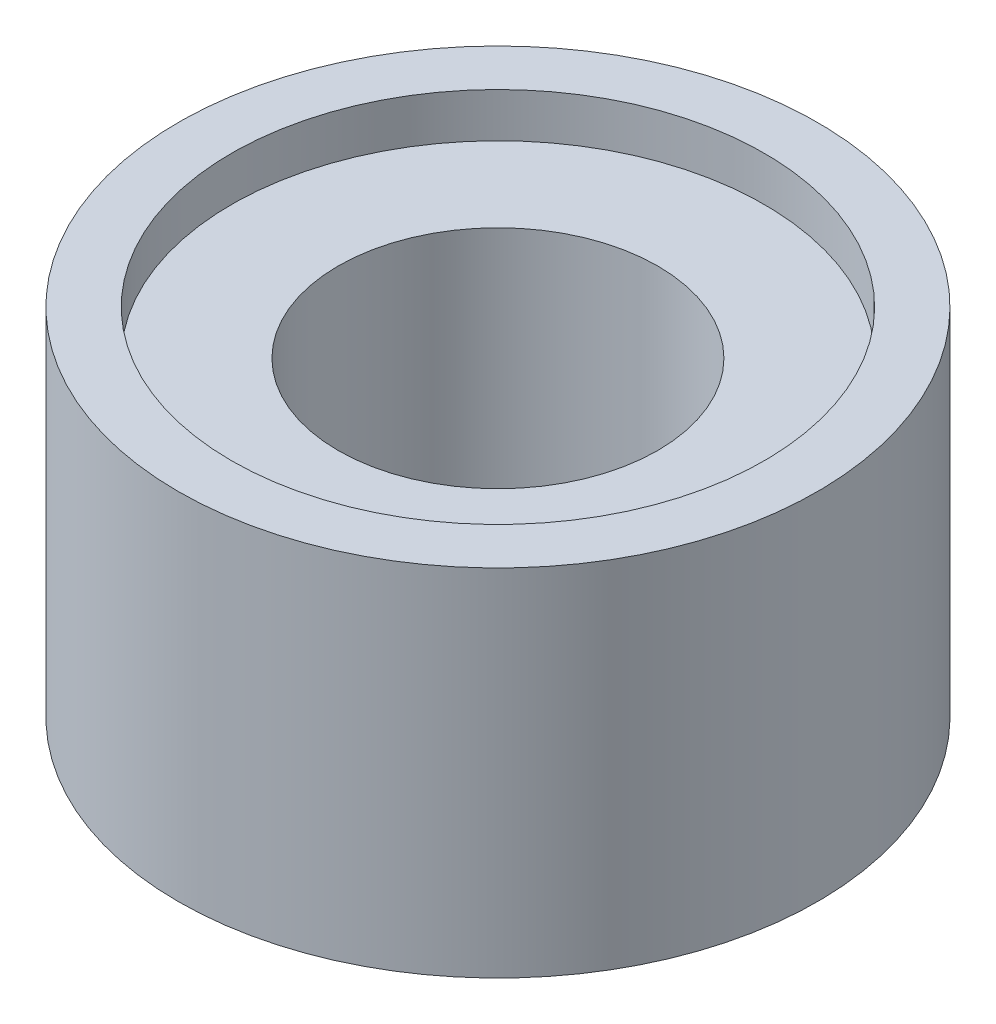
ISO-10303-21;
HEADER;
FILE_DESCRIPTION(('STEP AP214'),'2;1');
FILE_NAME('part.step','',(''),(''),'','','');
FILE_SCHEMA(('AUTOMOTIVE_DESIGN { 1 0 10303 214 1 1 1 1 }'));
ENDSEC;
DATA;
#1=APPLICATION_CONTEXT('core data for automotive mechanical design processes');
#2=APPLICATION_PROTOCOL_DEFINITION('international standard','automotive_design',2000,#1);
#3=PRODUCT_CONTEXT('',#1,'mechanical');
#4=PRODUCT('Part','Part','',(#3));
#5=PRODUCT_RELATED_PRODUCT_CATEGORY('part','',(#4));
#6=PRODUCT_DEFINITION_FORMATION('','',#4);
#7=PRODUCT_DEFINITION_CONTEXT('part definition',#1,'design');
#8=PRODUCT_DEFINITION('design','',#6,#7);
#9=PRODUCT_DEFINITION_SHAPE('','',#8);
#10=(LENGTH_UNIT() NAMED_UNIT(*) SI_UNIT(.MILLI.,.METRE.));
#11=(NAMED_UNIT(*) PLANE_ANGLE_UNIT() SI_UNIT($,.RADIAN.));
#12=(NAMED_UNIT(*) SI_UNIT($,.STERADIAN.) SOLID_ANGLE_UNIT());
#13=UNCERTAINTY_MEASURE_WITH_UNIT(LENGTH_MEASURE(1.E-05),#10,'distance_accuracy_value','');
#14=(GEOMETRIC_REPRESENTATION_CONTEXT(3) GLOBAL_UNCERTAINTY_ASSIGNED_CONTEXT((#13)) GLOBAL_UNIT_ASSIGNED_CONTEXT((#10,
#11,#12)) REPRESENTATION_CONTEXT('',''));
#15=CARTESIAN_POINT('',(0.,0.,0.));
#16=DIRECTION('',(0.,0.,1.));
#17=DIRECTION('',(1.,0.,0.));
#18=AXIS2_PLACEMENT_3D('',#15,#16,#17);
#19=CARTESIAN_POINT('',(0.,7.5,0.));
#20=DIRECTION('',(0.,1.,0.));
#21=DIRECTION('',(0.,0.,1.));
#22=AXIS2_PLACEMENT_3D('',#19,#20,#21);
#23=PLANE('',#22);
#24=CARTESIAN_POINT('',(0.,7.5,0.));
#25=DIRECTION('',(0.,1.,0.));
#26=DIRECTION('',(0.,0.,1.));
#27=AXIS2_PLACEMENT_3D('',#24,#25,#26);
#28=CIRCLE('',#27,15.);
#29=CARTESIAN_POINT('',(0.,7.5,15.));
#30=VERTEX_POINT('',#29);
#31=EDGE_CURVE('E46',#30,#30,#28,.F.);
#32=ORIENTED_EDGE('',*,*,#31,.F.);
#33=EDGE_LOOP('',(#32));
#34=FACE_BOUND('',#33,.T.);
#35=CARTESIAN_POINT('',(0.,7.5,0.));
#36=DIRECTION('',(0.,1.,0.));
#37=DIRECTION('',(0.,0.,1.));
#38=AXIS2_PLACEMENT_3D('',#35,#36,#37);
#39=CIRCLE('',#38,9.);
#40=CARTESIAN_POINT('',(0.,7.5,9.));
#41=VERTEX_POINT('',#40);
#42=EDGE_CURVE('E37',#41,#41,#39,.T.);
#43=ORIENTED_EDGE('',*,*,#42,.F.);
#44=EDGE_LOOP('',(#43));
#45=FACE_BOUND('',#44,.T.);
#46=ADVANCED_FACE('F30',(#34,#45),#23,.T.);
#47=CARTESIAN_POINT('',(0.,-7.5,0.));
#48=DIRECTION('',(0.,1.,0.));
#49=DIRECTION('',(0.,0.,1.));
#50=AXIS2_PLACEMENT_3D('',#47,#48,#49);
#51=PLANE('',#50);
#52=CARTESIAN_POINT('',(0.,-7.5,0.));
#53=DIRECTION('',(0.,1.,0.));
#54=DIRECTION('',(0.,0.,1.));
#55=AXIS2_PLACEMENT_3D('',#52,#53,#54);
#56=CIRCLE('',#55,15.);
#57=CARTESIAN_POINT('',(0.,-7.5,15.));
#58=VERTEX_POINT('',#57);
#59=EDGE_CURVE('E10',#58,#58,#56,.T.);
#60=ORIENTED_EDGE('',*,*,#59,.F.);
#61=EDGE_LOOP('',(#60));
#62=FACE_BOUND('',#61,.T.);
#63=CARTESIAN_POINT('',(0.,-7.5,0.));
#64=DIRECTION('',(0.,1.,0.));
#65=DIRECTION('',(0.,0.,1.));
#66=AXIS2_PLACEMENT_3D('',#63,#64,#65);
#67=CIRCLE('',#66,9.);
#68=CARTESIAN_POINT('',(0.,-7.5,9.));
#69=VERTEX_POINT('',#68);
#70=EDGE_CURVE('E41',#69,#69,#67,.T.);
#71=ORIENTED_EDGE('',*,*,#70,.T.);
#72=EDGE_LOOP('',(#71));
#73=FACE_BOUND('',#72,.T.);
#74=ADVANCED_FACE('F32',(#62,#73),#51,.F.);
#75=CARTESIAN_POINT('',(0.,7.5,0.));
#76=DIRECTION('',(0.,-1.,0.));
#77=DIRECTION('',(0.,0.,-1.));
#78=AXIS2_PLACEMENT_3D('',#75,#76,#77);
#79=CYLINDRICAL_SURFACE('',#78,9.);
#80=ORIENTED_EDGE('',*,*,#42,.T.);
#81=EDGE_LOOP('',(#80));
#82=FACE_BOUND('',#81,.T.);
#83=ORIENTED_EDGE('',*,*,#70,.F.);
#84=EDGE_LOOP('',(#83));
#85=FACE_BOUND('',#84,.T.);
#86=ADVANCED_FACE('F78',(#82,#85),#79,.F.);
#87=CARTESIAN_POINT('',(0.,10.,0.));
#88=DIRECTION('',(0.,-1.,0.));
#89=DIRECTION('',(0.,0.,-1.));
#90=AXIS2_PLACEMENT_3D('',#87,#88,#89);
#91=CYLINDRICAL_SURFACE('',#90,15.);
#92=CARTESIAN_POINT('',(0.,-10.,0.));
#93=DIRECTION('',(0.,1.,0.));
#94=DIRECTION('',(0.,0.,1.));
#95=AXIS2_PLACEMENT_3D('',#92,#93,#94);
#96=CIRCLE('',#95,15.);
#97=CARTESIAN_POINT('',(0.,-10.,15.));
#98=VERTEX_POINT('',#97);
#99=EDGE_CURVE('E57',#98,#98,#96,.T.);
#100=ORIENTED_EDGE('',*,*,#99,.F.);
#101=EDGE_LOOP('',(#100));
#102=FACE_BOUND('',#101,.T.);
#103=ORIENTED_EDGE('',*,*,#59,.T.);
#104=EDGE_LOOP('',(#103));
#105=FACE_BOUND('',#104,.T.);
#106=ADVANCED_FACE('F68',(#102,#105),#91,.F.);
#107=CARTESIAN_POINT('',(0.,10.,0.));
#108=DIRECTION('',(0.,1.,0.));
#109=DIRECTION('',(0.,0.,1.));
#110=AXIS2_PLACEMENT_3D('',#107,#108,#109);
#111=PLANE('',#110);
#112=CARTESIAN_POINT('',(0.,10.,0.));
#113=DIRECTION('',(0.,1.,0.));
#114=DIRECTION('',(0.,0.,1.));
#115=AXIS2_PLACEMENT_3D('',#112,#113,#114);
#116=CIRCLE('',#115,18.);
#117=CARTESIAN_POINT('',(0.,10.,18.));
#118=VERTEX_POINT('',#117);
#119=EDGE_CURVE('E50',#118,#118,#116,.T.);
#120=ORIENTED_EDGE('',*,*,#119,.T.);
#121=EDGE_LOOP('',(#120));
#122=FACE_BOUND('',#121,.T.);
#123=CARTESIAN_POINT('',(0.,10.,0.));
#124=DIRECTION('',(0.,1.,0.));
#125=DIRECTION('',(0.,0.,1.));
#126=AXIS2_PLACEMENT_3D('',#123,#124,#125);
#127=CIRCLE('',#126,15.);
#128=CARTESIAN_POINT('',(0.,10.,15.));
#129=VERTEX_POINT('',#128);
#130=EDGE_CURVE('E54',#129,#129,#127,.T.);
#131=ORIENTED_EDGE('',*,*,#130,.F.);
#132=EDGE_LOOP('',(#131));
#133=FACE_BOUND('',#132,.T.);
#134=ADVANCED_FACE('F65',(#122,#133),#111,.T.);
#135=CARTESIAN_POINT('',(0.,-10.,0.));
#136=DIRECTION('',(0.,1.,0.));
#137=DIRECTION('',(0.,0.,1.));
#138=AXIS2_PLACEMENT_3D('',#135,#136,#137);
#139=PLANE('',#138);
#140=CARTESIAN_POINT('',(0.,-10.,0.));
#141=DIRECTION('',(0.,1.,0.));
#142=DIRECTION('',(0.,0.,1.));
#143=AXIS2_PLACEMENT_3D('',#140,#141,#142);
#144=CIRCLE('',#143,18.);
#145=CARTESIAN_POINT('',(0.,-10.,18.));
#146=VERTEX_POINT('',#145);
#147=EDGE_CURVE('E51',#146,#146,#144,.T.);
#148=ORIENTED_EDGE('',*,*,#147,.F.);
#149=EDGE_LOOP('',(#148));
#150=FACE_BOUND('',#149,.T.);
#151=ORIENTED_EDGE('',*,*,#99,.T.);
#152=EDGE_LOOP('',(#151));
#153=FACE_BOUND('',#152,.T.);
#154=ADVANCED_FACE('F67',(#150,#153),#139,.F.);
#155=CARTESIAN_POINT('',(0.,10.,0.));
#156=DIRECTION('',(0.,-1.,0.));
#157=DIRECTION('',(0.,0.,-1.));
#158=AXIS2_PLACEMENT_3D('',#155,#156,#157);
#159=CYLINDRICAL_SURFACE('',#158,18.);
#160=ORIENTED_EDGE('',*,*,#119,.F.);
#161=EDGE_LOOP('',(#160));
#162=FACE_BOUND('',#161,.T.);
#163=ORIENTED_EDGE('',*,*,#147,.T.);
#164=EDGE_LOOP('',(#163));
#165=FACE_BOUND('',#164,.T.);
#166=ADVANCED_FACE('F75',(#162,#165),#159,.T.);
#167=ORIENTED_EDGE('',*,*,#31,.T.);
#168=EDGE_LOOP('',(#167));
#169=FACE_BOUND('',#168,.T.);
#170=ORIENTED_EDGE('',*,*,#130,.T.);
#171=EDGE_LOOP('',(#170));
#172=FACE_BOUND('',#171,.T.);
#173=ADVANCED_FACE('F63',(#169,#172),#91,.F.);
#174=CLOSED_SHELL('',(#46,#74,#86,#106,#134,#154,#166,#173));
#175=MANIFOLD_SOLID_BREP('B2',#174);
#176=ADVANCED_BREP_SHAPE_REPRESENTATION('',(#18,#175),#14);
#177=SHAPE_DEFINITION_REPRESENTATION(#9,#176);
ENDSEC;
END-ISO-10303-21;
